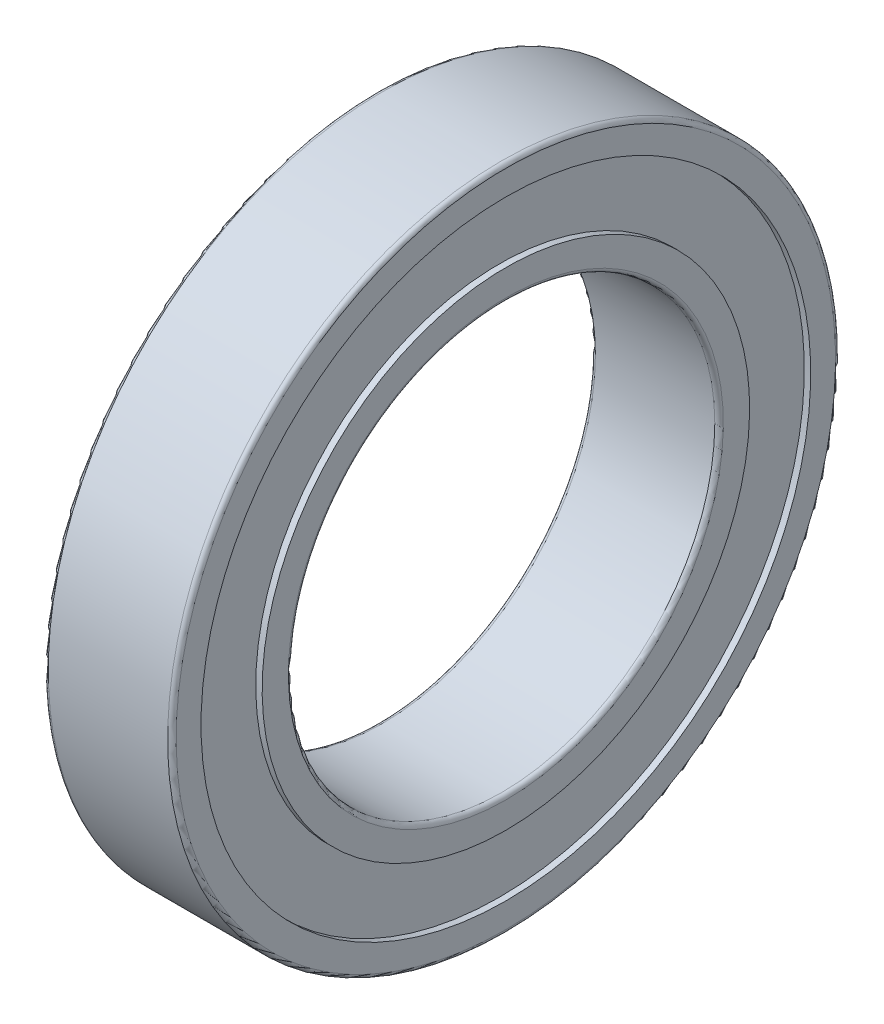
ISO-10303-21;
HEADER;
FILE_DESCRIPTION(('STEP AP214'),'2;1');
FILE_NAME('part.step','',(''),(''),'','','');
FILE_SCHEMA(('AUTOMOTIVE_DESIGN { 1 0 10303 214 1 1 1 1 }'));
ENDSEC;
DATA;
#1=APPLICATION_CONTEXT('core data for automotive mechanical design processes');
#2=APPLICATION_PROTOCOL_DEFINITION('international standard','automotive_design',2000,#1);
#3=PRODUCT_CONTEXT('',#1,'mechanical');
#4=PRODUCT('Part','Part','',(#3));
#5=PRODUCT_RELATED_PRODUCT_CATEGORY('part','',(#4));
#6=PRODUCT_DEFINITION_FORMATION('','',#4);
#7=PRODUCT_DEFINITION_CONTEXT('part definition',#1,'design');
#8=PRODUCT_DEFINITION('design','',#6,#7);
#9=PRODUCT_DEFINITION_SHAPE('','',#8);
#10=(LENGTH_UNIT() NAMED_UNIT(*) SI_UNIT(.MILLI.,.METRE.));
#11=(NAMED_UNIT(*) PLANE_ANGLE_UNIT() SI_UNIT($,.RADIAN.));
#12=(NAMED_UNIT(*) SI_UNIT($,.STERADIAN.) SOLID_ANGLE_UNIT());
#13=UNCERTAINTY_MEASURE_WITH_UNIT(LENGTH_MEASURE(1.E-05),#10,'distance_accuracy_value','');
#14=(GEOMETRIC_REPRESENTATION_CONTEXT(3) GLOBAL_UNCERTAINTY_ASSIGNED_CONTEXT((#13)) GLOBAL_UNIT_ASSIGNED_CONTEXT((#10,
#11,#12)) REPRESENTATION_CONTEXT('',''));
#15=CARTESIAN_POINT('',(0.,0.,0.));
#16=DIRECTION('',(0.,0.,1.));
#17=DIRECTION('',(1.,0.,0.));
#18=AXIS2_PLACEMENT_3D('',#15,#16,#17);
#19=CARTESIAN_POINT('',(0.,0.,0.));
#20=DIRECTION('',(-1.,0.,0.));
#21=DIRECTION('',(0.,-1.,0.));
#22=AXIS2_PLACEMENT_3D('',#19,#20,#21);
#23=CYLINDRICAL_SURFACE('',#22,15.);
#24=CARTESIAN_POINT('',(0.300000000000001,0.,0.));
#25=DIRECTION('',(1.,0.,0.));
#26=DIRECTION('',(0.,1.,0.));
#27=AXIS2_PLACEMENT_3D('',#24,#25,#26);
#28=CIRCLE('',#27,15.);
#29=CARTESIAN_POINT('',(0.3,15.,0.));
#30=VERTEX_POINT('',#29);
#31=EDGE_CURVE('E57',#30,#30,#28,.F.);
#32=ORIENTED_EDGE('',*,*,#31,.T.);
#33=EDGE_LOOP('',(#32));
#34=FACE_BOUND('',#33,.T.);
#35=CARTESIAN_POINT('',(8.7,0.,0.));
#36=DIRECTION('',(-1.,0.,0.));
#37=DIRECTION('',(0.,-1.,0.));
#38=AXIS2_PLACEMENT_3D('',#35,#36,#37);
#39=CIRCLE('',#38,15.);
#40=CARTESIAN_POINT('',(8.7,-15.,0.));
#41=VERTEX_POINT('',#40);
#42=EDGE_CURVE('E60',#41,#41,#39,.F.);
#43=ORIENTED_EDGE('',*,*,#42,.T.);
#44=EDGE_LOOP('',(#43));
#45=FACE_BOUND('',#44,.T.);
#46=ADVANCED_FACE('F31',(#34,#45),#23,.F.);
#47=CARTESIAN_POINT('',(0.,15.,0.));
#48=DIRECTION('',(1.,0.,0.));
#49=DIRECTION('',(0.,1.,0.));
#50=AXIS2_PLACEMENT_3D('',#47,#48,#49);
#51=PLANE('',#50);
#52=CARTESIAN_POINT('',(0.,0.,0.));
#53=DIRECTION('',(1.,0.,0.));
#54=DIRECTION('',(0.,1.,0.));
#55=AXIS2_PLACEMENT_3D('',#52,#53,#54);
#56=CIRCLE('',#55,15.3);
#57=CARTESIAN_POINT('',(0.,15.3,0.));
#58=VERTEX_POINT('',#57);
#59=EDGE_CURVE('E54',#58,#58,#56,.T.);
#60=ORIENTED_EDGE('',*,*,#59,.T.);
#61=EDGE_LOOP('',(#60));
#62=FACE_BOUND('',#61,.T.);
#63=CARTESIAN_POINT('',(0.,0.,0.));
#64=DIRECTION('',(-1.,0.,0.));
#65=DIRECTION('',(0.,-1.,0.));
#66=AXIS2_PLACEMENT_3D('',#63,#64,#65);
#67=CIRCLE('',#66,17.15);
#68=CARTESIAN_POINT('',(0.,-17.15,0.));
#69=VERTEX_POINT('',#68);
#70=EDGE_CURVE('E63',#69,#69,#67,.T.);
#71=ORIENTED_EDGE('',*,*,#70,.T.);
#72=EDGE_LOOP('',(#71));
#73=FACE_BOUND('',#72,.T.);
#74=ADVANCED_FACE('F106',(#62,#73),#51,.F.);
#75=CARTESIAN_POINT('',(0.,0.,0.));
#76=DIRECTION('',(-1.,0.,0.));
#77=DIRECTION('',(0.,-1.,0.));
#78=AXIS2_PLACEMENT_3D('',#75,#76,#77);
#79=CYLINDRICAL_SURFACE('',#78,17.15);
#80=ORIENTED_EDGE('',*,*,#70,.F.);
#81=EDGE_LOOP('',(#80));
#82=FACE_BOUND('',#81,.T.);
#83=CARTESIAN_POINT('',(0.450000000000001,0.,0.));
#84=DIRECTION('',(-1.,0.,0.));
#85=DIRECTION('',(0.,-1.,0.));
#86=AXIS2_PLACEMENT_3D('',#83,#84,#85);
#87=CIRCLE('',#86,17.15);
#88=CARTESIAN_POINT('',(0.450000000000002,-17.15,0.));
#89=VERTEX_POINT('',#88);
#90=EDGE_CURVE('E66',#89,#89,#87,.T.);
#91=ORIENTED_EDGE('',*,*,#90,.T.);
#92=EDGE_LOOP('',(#91));
#93=FACE_BOUND('',#92,.T.);
#94=ADVANCED_FACE('F112',(#82,#93),#79,.T.);
#95=CARTESIAN_POINT('',(0.45,17.15,0.));
#96=DIRECTION('',(1.,0.,0.));
#97=DIRECTION('',(0.,1.,0.));
#98=AXIS2_PLACEMENT_3D('',#95,#96,#97);
#99=PLANE('',#98);
#100=ORIENTED_EDGE('',*,*,#90,.F.);
#101=EDGE_LOOP('',(#100));
#102=FACE_BOUND('',#101,.T.);
#103=CARTESIAN_POINT('',(0.450000000000001,0.,0.));
#104=DIRECTION('',(-1.,0.,0.));
#105=DIRECTION('',(0.,-1.,0.));
#106=AXIS2_PLACEMENT_3D('',#103,#104,#105);
#107=CIRCLE('',#106,21.45);
#108=CARTESIAN_POINT('',(0.450000000000003,-21.45,0.));
#109=VERTEX_POINT('',#108);
#110=EDGE_CURVE('E69',#109,#109,#107,.T.);
#111=ORIENTED_EDGE('',*,*,#110,.T.);
#112=EDGE_LOOP('',(#111));
#113=FACE_BOUND('',#112,.T.);
#114=ADVANCED_FACE('F139',(#102,#113),#99,.F.);
#115=CARTESIAN_POINT('',(0.,0.,0.));
#116=DIRECTION('',(-1.,0.,0.));
#117=DIRECTION('',(0.,-1.,0.));
#118=AXIS2_PLACEMENT_3D('',#115,#116,#117);
#119=CYLINDRICAL_SURFACE('',#118,21.45);
#120=ORIENTED_EDGE('',*,*,#110,.F.);
#121=EDGE_LOOP('',(#120));
#122=FACE_BOUND('',#121,.T.);
#123=CARTESIAN_POINT('',(0.,0.,0.));
#124=DIRECTION('',(-1.,0.,0.));
#125=DIRECTION('',(0.,-1.,0.));
#126=AXIS2_PLACEMENT_3D('',#123,#124,#125);
#127=CIRCLE('',#126,21.45);
#128=CARTESIAN_POINT('',(0.,-21.45,0.));
#129=VERTEX_POINT('',#128);
#130=EDGE_CURVE('E72',#129,#129,#127,.T.);
#131=ORIENTED_EDGE('',*,*,#130,.T.);
#132=EDGE_LOOP('',(#131));
#133=FACE_BOUND('',#132,.T.);
#134=ADVANCED_FACE('F134',(#122,#133),#119,.F.);
#135=CARTESIAN_POINT('',(0.,21.45,0.));
#136=DIRECTION('',(1.,0.,0.));
#137=DIRECTION('',(0.,1.,0.));
#138=AXIS2_PLACEMENT_3D('',#135,#136,#137);
#139=PLANE('',#138);
#140=CARTESIAN_POINT('',(0.,0.,0.));
#141=DIRECTION('',(1.,0.,0.));
#142=DIRECTION('',(0.,1.,0.));
#143=AXIS2_PLACEMENT_3D('',#140,#141,#142);
#144=CIRCLE('',#143,23.2);
#145=CARTESIAN_POINT('',(0.,23.2,0.));
#146=VERTEX_POINT('',#145);
#147=EDGE_CURVE('E46',#146,#146,#144,.F.);
#148=ORIENTED_EDGE('',*,*,#147,.T.);
#149=EDGE_LOOP('',(#148));
#150=FACE_BOUND('',#149,.T.);
#151=ORIENTED_EDGE('',*,*,#130,.F.);
#152=EDGE_LOOP('',(#151));
#153=FACE_BOUND('',#152,.T.);
#154=ADVANCED_FACE('F130',(#150,#153),#139,.F.);
#155=CARTESIAN_POINT('',(0.,0.,0.));
#156=DIRECTION('',(-1.,0.,0.));
#157=DIRECTION('',(0.,-1.,0.));
#158=AXIS2_PLACEMENT_3D('',#155,#156,#157);
#159=CYLINDRICAL_SURFACE('',#158,23.5);
#160=CARTESIAN_POINT('',(0.300000000000002,0.,0.));
#161=DIRECTION('',(1.,0.,0.));
#162=DIRECTION('',(0.,1.,0.));
#163=AXIS2_PLACEMENT_3D('',#160,#161,#162);
#164=CIRCLE('',#163,23.5);
#165=CARTESIAN_POINT('',(0.3,23.5,0.));
#166=VERTEX_POINT('',#165);
#167=EDGE_CURVE('E38',#166,#166,#164,.T.);
#168=ORIENTED_EDGE('',*,*,#167,.T.);
#169=EDGE_LOOP('',(#168));
#170=FACE_BOUND('',#169,.T.);
#171=CARTESIAN_POINT('',(8.7,0.,0.));
#172=DIRECTION('',(-1.,0.,0.));
#173=DIRECTION('',(0.,-1.,0.));
#174=AXIS2_PLACEMENT_3D('',#171,#172,#173);
#175=CIRCLE('',#174,23.5);
#176=CARTESIAN_POINT('',(8.7,-23.5,0.));
#177=VERTEX_POINT('',#176);
#178=EDGE_CURVE('E42',#177,#177,#175,.T.);
#179=ORIENTED_EDGE('',*,*,#178,.T.);
#180=EDGE_LOOP('',(#179));
#181=FACE_BOUND('',#180,.T.);
#182=ADVANCED_FACE('F133',(#170,#181),#159,.T.);
#183=CARTESIAN_POINT('',(9.,23.5,0.));
#184=DIRECTION('',(-1.,0.,0.));
#185=DIRECTION('',(0.,-1.,0.));
#186=AXIS2_PLACEMENT_3D('',#183,#184,#185);
#187=PLANE('',#186);
#188=CARTESIAN_POINT('',(9.,0.,0.));
#189=DIRECTION('',(-1.,0.,0.));
#190=DIRECTION('',(0.,-1.,0.));
#191=AXIS2_PLACEMENT_3D('',#188,#189,#190);
#192=CIRCLE('',#191,23.2);
#193=CARTESIAN_POINT('',(9.,-23.2,0.));
#194=VERTEX_POINT('',#193);
#195=EDGE_CURVE('E10',#194,#194,#192,.F.);
#196=ORIENTED_EDGE('',*,*,#195,.T.);
#197=EDGE_LOOP('',(#196));
#198=FACE_BOUND('',#197,.T.);
#199=CARTESIAN_POINT('',(9.,0.,0.));
#200=DIRECTION('',(-1.,0.,0.));
#201=DIRECTION('',(0.,-1.,0.));
#202=AXIS2_PLACEMENT_3D('',#199,#200,#201);
#203=CIRCLE('',#202,21.45);
#204=CARTESIAN_POINT('',(9.,-21.45,0.));
#205=VERTEX_POINT('',#204);
#206=EDGE_CURVE('E75',#205,#205,#203,.T.);
#207=ORIENTED_EDGE('',*,*,#206,.T.);
#208=EDGE_LOOP('',(#207));
#209=FACE_BOUND('',#208,.T.);
#210=ADVANCED_FACE('F179',(#198,#209),#187,.F.);
#211=CARTESIAN_POINT('',(0.,0.,0.));
#212=DIRECTION('',(-1.,0.,0.));
#213=DIRECTION('',(0.,-1.,0.));
#214=AXIS2_PLACEMENT_3D('',#211,#212,#213);
#215=CYLINDRICAL_SURFACE('',#214,21.45);
#216=ORIENTED_EDGE('',*,*,#206,.F.);
#217=EDGE_LOOP('',(#216));
#218=FACE_BOUND('',#217,.T.);
#219=CARTESIAN_POINT('',(8.55,0.,0.));
#220=DIRECTION('',(-1.,0.,0.));
#221=DIRECTION('',(0.,-1.,0.));
#222=AXIS2_PLACEMENT_3D('',#219,#220,#221);
#223=CIRCLE('',#222,21.45);
#224=CARTESIAN_POINT('',(8.55,-21.45,0.));
#225=VERTEX_POINT('',#224);
#226=EDGE_CURVE('E78',#225,#225,#223,.T.);
#227=ORIENTED_EDGE('',*,*,#226,.T.);
#228=EDGE_LOOP('',(#227));
#229=FACE_BOUND('',#228,.T.);
#230=ADVANCED_FACE('F174',(#218,#229),#215,.F.);
#231=CARTESIAN_POINT('',(8.55,21.45,0.));
#232=DIRECTION('',(-1.,0.,0.));
#233=DIRECTION('',(0.,-1.,0.));
#234=AXIS2_PLACEMENT_3D('',#231,#232,#233);
#235=PLANE('',#234);
#236=ORIENTED_EDGE('',*,*,#226,.F.);
#237=EDGE_LOOP('',(#236));
#238=FACE_BOUND('',#237,.T.);
#239=CARTESIAN_POINT('',(8.55,0.,0.));
#240=DIRECTION('',(-1.,0.,0.));
#241=DIRECTION('',(0.,-1.,0.));
#242=AXIS2_PLACEMENT_3D('',#239,#240,#241);
#243=CIRCLE('',#242,17.15);
#244=CARTESIAN_POINT('',(8.55,-17.15,0.));
#245=VERTEX_POINT('',#244);
#246=EDGE_CURVE('E81',#245,#245,#243,.T.);
#247=ORIENTED_EDGE('',*,*,#246,.T.);
#248=EDGE_LOOP('',(#247));
#249=FACE_BOUND('',#248,.T.);
#250=ADVANCED_FACE('F102',(#238,#249),#235,.F.);
#251=CARTESIAN_POINT('',(0.,0.,0.));
#252=DIRECTION('',(-1.,0.,0.));
#253=DIRECTION('',(0.,-1.,0.));
#254=AXIS2_PLACEMENT_3D('',#251,#252,#253);
#255=CYLINDRICAL_SURFACE('',#254,17.15);
#256=ORIENTED_EDGE('',*,*,#246,.F.);
#257=EDGE_LOOP('',(#256));
#258=FACE_BOUND('',#257,.T.);
#259=CARTESIAN_POINT('',(9.,0.,0.));
#260=DIRECTION('',(-1.,0.,0.));
#261=DIRECTION('',(0.,-1.,0.));
#262=AXIS2_PLACEMENT_3D('',#259,#260,#261);
#263=CIRCLE('',#262,17.15);
#264=CARTESIAN_POINT('',(9.,-17.15,0.));
#265=VERTEX_POINT('',#264);
#266=EDGE_CURVE('E84',#265,#265,#263,.T.);
#267=ORIENTED_EDGE('',*,*,#266,.T.);
#268=EDGE_LOOP('',(#267));
#269=FACE_BOUND('',#268,.T.);
#270=ADVANCED_FACE('F88',(#258,#269),#255,.T.);
#271=CARTESIAN_POINT('',(9.,17.15,0.));
#272=DIRECTION('',(-1.,0.,0.));
#273=DIRECTION('',(0.,-1.,0.));
#274=AXIS2_PLACEMENT_3D('',#271,#272,#273);
#275=PLANE('',#274);
#276=CARTESIAN_POINT('',(9.,0.,0.));
#277=DIRECTION('',(-1.,0.,0.));
#278=DIRECTION('',(0.,-1.,0.));
#279=AXIS2_PLACEMENT_3D('',#276,#277,#278);
#280=CIRCLE('',#279,15.3);
#281=CARTESIAN_POINT('',(9.,-15.3,0.));
#282=VERTEX_POINT('',#281);
#283=EDGE_CURVE('E51',#282,#282,#280,.T.);
#284=ORIENTED_EDGE('',*,*,#283,.T.);
#285=EDGE_LOOP('',(#284));
#286=FACE_BOUND('',#285,.T.);
#287=ORIENTED_EDGE('',*,*,#266,.F.);
#288=EDGE_LOOP('',(#287));
#289=FACE_BOUND('',#288,.T.);
#290=ADVANCED_FACE('F90',(#286,#289),#275,.F.);
#291=CARTESIAN_POINT('',(0.300000000000001,0.,0.));
#292=DIRECTION('',(1.,0.,0.));
#293=DIRECTION('',(0.,1.,0.));
#294=AXIS2_PLACEMENT_3D('',#291,#292,#293);
#295=TOROIDAL_SURFACE('',#294,15.3,0.3);
#296=ORIENTED_EDGE('',*,*,#59,.F.);
#297=EDGE_LOOP('',(#296));
#298=FACE_BOUND('',#297,.T.);
#299=ORIENTED_EDGE('',*,*,#31,.F.);
#300=EDGE_LOOP('',(#299));
#301=FACE_BOUND('',#300,.T.);
#302=ADVANCED_FACE('F92',(#298,#301),#295,.T.);
#303=CARTESIAN_POINT('',(8.7,0.,0.));
#304=DIRECTION('',(-1.,0.,0.));
#305=DIRECTION('',(0.,-1.,0.));
#306=AXIS2_PLACEMENT_3D('',#303,#304,#305);
#307=TOROIDAL_SURFACE('',#306,15.3,0.3);
#308=ORIENTED_EDGE('',*,*,#42,.F.);
#309=EDGE_LOOP('',(#308));
#310=FACE_BOUND('',#309,.T.);
#311=ORIENTED_EDGE('',*,*,#283,.F.);
#312=EDGE_LOOP('',(#311));
#313=FACE_BOUND('',#312,.T.);
#314=ADVANCED_FACE('F99',(#310,#313),#307,.T.);
#315=CARTESIAN_POINT('',(0.300000000000002,0.,0.));
#316=DIRECTION('',(1.,0.,0.));
#317=DIRECTION('',(0.,1.,0.));
#318=AXIS2_PLACEMENT_3D('',#315,#316,#317);
#319=TOROIDAL_SURFACE('',#318,23.2,0.3);
#320=ORIENTED_EDGE('',*,*,#167,.F.);
#321=EDGE_LOOP('',(#320));
#322=FACE_BOUND('',#321,.T.);
#323=ORIENTED_EDGE('',*,*,#147,.F.);
#324=EDGE_LOOP('',(#323));
#325=FACE_BOUND('',#324,.T.);
#326=ADVANCED_FACE('F119',(#322,#325),#319,.T.);
#327=CARTESIAN_POINT('',(8.7,0.,0.));
#328=DIRECTION('',(-1.,0.,0.));
#329=DIRECTION('',(0.,-1.,0.));
#330=AXIS2_PLACEMENT_3D('',#327,#328,#329);
#331=TOROIDAL_SURFACE('',#330,23.2,0.3);
#332=ORIENTED_EDGE('',*,*,#195,.F.);
#333=EDGE_LOOP('',(#332));
#334=FACE_BOUND('',#333,.T.);
#335=ORIENTED_EDGE('',*,*,#178,.F.);
#336=EDGE_LOOP('',(#335));
#337=FACE_BOUND('',#336,.T.);
#338=ADVANCED_FACE('F33',(#334,#337),#331,.T.);
#339=CLOSED_SHELL('',(#46,#74,#94,#114,#134,#154,#182,#210,#230,#250,#270,#290,#302,#314,#326,#338));
#340=MANIFOLD_SOLID_BREP('B2',#339);
#341=ADVANCED_BREP_SHAPE_REPRESENTATION('',(#18,#340),#14);
#342=SHAPE_DEFINITION_REPRESENTATION(#9,#341);
ENDSEC;
END-ISO-10303-21;
